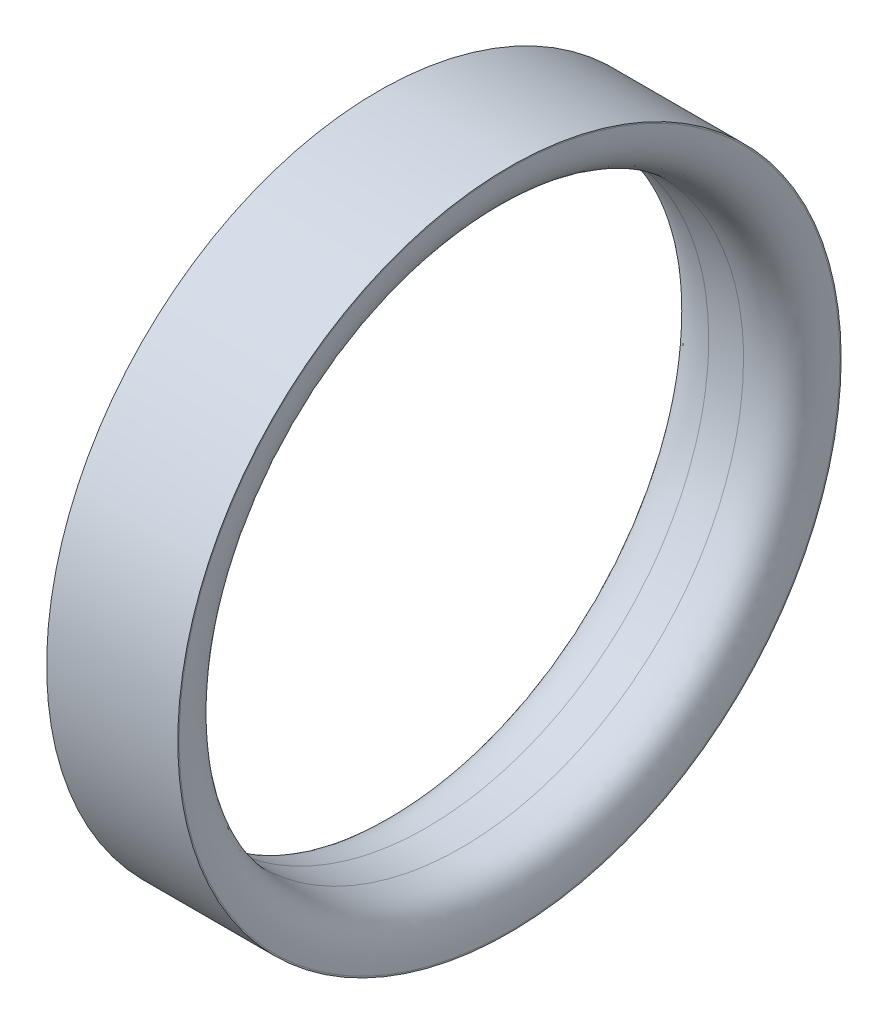
ISO-10303-21;
HEADER;
FILE_DESCRIPTION(('STEP AP214'),'2;1');
FILE_NAME('part.step','',(''),(''),'','','');
FILE_SCHEMA(('AUTOMOTIVE_DESIGN { 1 0 10303 214 1 1 1 1 }'));
ENDSEC;
DATA;
#1=APPLICATION_CONTEXT('core data for automotive mechanical design processes');
#2=APPLICATION_PROTOCOL_DEFINITION('international standard','automotive_design',2000,#1);
#3=PRODUCT_CONTEXT('',#1,'mechanical');
#4=PRODUCT('Part','Part','',(#3));
#5=PRODUCT_RELATED_PRODUCT_CATEGORY('part','',(#4));
#6=PRODUCT_DEFINITION_FORMATION('','',#4);
#7=PRODUCT_DEFINITION_CONTEXT('part definition',#1,'design');
#8=PRODUCT_DEFINITION('design','',#6,#7);
#9=PRODUCT_DEFINITION_SHAPE('','',#8);
#10=(LENGTH_UNIT() NAMED_UNIT(*) SI_UNIT(.MILLI.,.METRE.));
#11=(NAMED_UNIT(*) PLANE_ANGLE_UNIT() SI_UNIT($,.RADIAN.));
#12=(NAMED_UNIT(*) SI_UNIT($,.STERADIAN.) SOLID_ANGLE_UNIT());
#13=UNCERTAINTY_MEASURE_WITH_UNIT(LENGTH_MEASURE(1.E-05),#10,'distance_accuracy_value','');
#14=(GEOMETRIC_REPRESENTATION_CONTEXT(3) GLOBAL_UNCERTAINTY_ASSIGNED_CONTEXT((#13)) GLOBAL_UNIT_ASSIGNED_CONTEXT((#10,
#11,#12)) REPRESENTATION_CONTEXT('',''));
#15=CARTESIAN_POINT('',(0.,0.,0.));
#16=DIRECTION('',(0.,0.,1.));
#17=DIRECTION('',(1.,0.,0.));
#18=AXIS2_PLACEMENT_3D('',#15,#16,#17);
#19=CARTESIAN_POINT('',(0.,0.,0.));
#20=DIRECTION('',(-1.,0.,0.));
#21=DIRECTION('',(0.,0.,1.));
#22=AXIS2_PLACEMENT_3D('',#19,#20,#21);
#23=PLANE('',#22);
#24=CARTESIAN_POINT('',(0.,0.,-34.2915735093941));
#25=CARTESIAN_POINT('',(0.,-4.48815243783443,-34.2915735093941));
#26=CARTESIAN_POINT('',(0.,-13.4644573135032,-32.5060754562533));
#27=CARTESIAN_POINT('',(0.,-24.8790730566352,-24.8790730566351));
#28=CARTESIAN_POINT('',(0.,-32.5060754562532,-13.4644573135034));
#29=CARTESIAN_POINT('',(0.,-35.1843225359646,0.));
#30=CARTESIAN_POINT('',(0.,-32.5060754562532,13.4644573135033));
#31=CARTESIAN_POINT('',(0.,-24.8790730566352,24.8790730566352));
#32=CARTESIAN_POINT('',(0.,-13.4644573135033,32.5060754562532));
#33=CARTESIAN_POINT('',(0.,0.,35.1843225359645));
#34=CARTESIAN_POINT('',(0.,13.4644573135033,32.5060754562532));
#35=CARTESIAN_POINT('',(0.,24.8790730566352,24.8790730566352));
#36=CARTESIAN_POINT('',(0.,32.5060754562533,13.4644573135033));
#37=CARTESIAN_POINT('',(0.,35.1843225359645,0.));
#38=CARTESIAN_POINT('',(0.,32.5060754562532,-13.4644573135033));
#39=CARTESIAN_POINT('',(0.,24.8790730566351,-24.8790730566352));
#40=CARTESIAN_POINT('',(0.,13.4644573135034,-32.5060754562532));
#41=CARTESIAN_POINT('',(0.,4.48815243783444,-34.2915735093941));
#42=CARTESIAN_POINT('',(0.,0.,-34.2915735093941));
#43=B_SPLINE_CURVE_WITH_KNOTS('',3,(#24,#25,#26,#27,#28,#29,#30,#31,#32,#33,#34,#35,#36,#37,#38,
#39,#40,#41,#42),.UNSPECIFIED.,.T.,.F.,(4,1,1,1,1,1,1,1,1,1,1,1,1,1,1,1,4),(-3.14159265358979,
-2.74889357189107,-2.35619449019235,-1.96349540849362,-1.5707963267949,-1.17809724509617,
-0.785398163397448,-0.392699081698724,0.,0.392699081698724,0.785398163397448,1.17809724509617,
1.5707963267949,1.96349540849362,2.35619449019234,2.74889357189107,3.14159265358979),.UNSPECIFIED.);
#44=CARTESIAN_POINT('',(0.,0.,-34.2915735093941));
#45=VERTEX_POINT('',#44);
#46=EDGE_CURVE('E76',#45,#45,#43,.F.);
#47=ORIENTED_EDGE('',*,*,#46,.T.);
#48=EDGE_LOOP('',(#47));
#49=FACE_BOUND('',#48,.T.);
#50=CARTESIAN_POINT('',(0.,0.,0.));
#51=DIRECTION('',(1.,0.,0.));
#52=DIRECTION('',(0.,0.,-1.));
#53=AXIS2_PLACEMENT_3D('',#50,#51,#52);
#54=CIRCLE('',#53,34.4249561596386);
#55=CARTESIAN_POINT('',(0.,0.,-34.4249561596386));
#56=VERTEX_POINT('',#55);
#57=EDGE_CURVE('E82',#56,#56,#54,.T.);
#58=ORIENTED_EDGE('',*,*,#57,.F.);
#59=EDGE_LOOP('',(#58));
#60=FACE_BOUND('',#59,.T.);
#61=ADVANCED_FACE('F50',(#49,#60),#23,.T.);
#62=CARTESIAN_POINT('',(13.6098663886943,0.,0.));
#63=DIRECTION('',(1.,0.,0.));
#64=DIRECTION('',(0.,0.,-1.));
#65=AXIS2_PLACEMENT_3D('',#62,#63,#64);
#66=CYLINDRICAL_SURFACE('',#65,34.4249561596386);
#67=ORIENTED_EDGE('',*,*,#57,.T.);
#68=EDGE_LOOP('',(#67));
#69=FACE_BOUND('',#68,.T.);
#70=CARTESIAN_POINT('',(13.6098663886943,0.,0.));
#71=DIRECTION('',(1.,0.,0.));
#72=DIRECTION('',(0.,0.,-1.));
#73=AXIS2_PLACEMENT_3D('',#70,#71,#72);
#74=CIRCLE('',#73,34.4249561596386);
#75=CARTESIAN_POINT('',(13.6098663886943,0.,-34.4249561596386));
#76=VERTEX_POINT('',#75);
#77=EDGE_CURVE('E88',#76,#76,#74,.T.);
#78=ORIENTED_EDGE('',*,*,#77,.F.);
#79=EDGE_LOOP('',(#78));
#80=FACE_BOUND('',#79,.T.);
#81=ADVANCED_FACE('F115',(#69,#80),#66,.T.);
#82=CARTESIAN_POINT('',(13.6098663886943,34.4249561596386,0.));
#83=DIRECTION('',(1.,0.,0.));
#84=DIRECTION('',(0.,0.,-1.));
#85=AXIS2_PLACEMENT_3D('',#82,#83,#84);
#86=PLANE('',#85);
#87=CARTESIAN_POINT('',(13.6098663886943,0.,-34.2915735093941));
#88=CARTESIAN_POINT('',(13.6098663886943,4.48815243783444,-34.2915735093941));
#89=CARTESIAN_POINT('',(13.6098663886943,13.4644573135033,-32.5060754562533));
#90=CARTESIAN_POINT('',(13.6098663886943,24.8790730566352,-24.8790730566352));
#91=CARTESIAN_POINT('',(13.6098663886943,32.5060754562533,-13.4644573135033));
#92=CARTESIAN_POINT('',(13.6098663886943,35.1843225359646,0.));
#93=CARTESIAN_POINT('',(13.6098663886943,32.5060754562533,13.4644573135033));
#94=CARTESIAN_POINT('',(13.6098663886943,24.8790730566352,24.8790730566352));
#95=CARTESIAN_POINT('',(13.6098663886943,13.4644573135034,32.5060754562532));
#96=CARTESIAN_POINT('',(13.6098663886943,0.,35.1843225359646));
#97=CARTESIAN_POINT('',(13.6098663886943,-13.4644573135032,32.5060754562533));
#98=CARTESIAN_POINT('',(13.6098663886943,-24.8790730566353,24.8790730566351));
#99=CARTESIAN_POINT('',(13.6098663886943,-32.5060754562532,13.4644573135034));
#100=CARTESIAN_POINT('',(13.6098663886943,-35.1843225359646,-1.42954417275217E-13));
#101=CARTESIAN_POINT('',(13.6098663886943,-32.5060754562533,-13.4644573135032));
#102=CARTESIAN_POINT('',(13.6098663886943,-24.8790730566353,-24.8790730566351));
#103=CARTESIAN_POINT('',(13.6098663886943,-13.4644573135033,-32.5060754562533));
#104=CARTESIAN_POINT('',(13.6098663886943,-4.48815243783444,-34.2915735093941));
#105=CARTESIAN_POINT('',(13.6098663886943,0.,-34.2915735093941));
#106=B_SPLINE_CURVE_WITH_KNOTS('',3,(#87,#88,#89,#90,#91,#92,#93,#94,#95,#96,#97,#98,#99,#100,
#101,#102,#103,#104,#105),.UNSPECIFIED.,.T.,.F.,(4,1,1,1,1,1,1,1,1,1,1,1,1,1,1,1,4),(0.,
0.392699081698724,0.785398163397448,1.17809724509617,1.5707963267949,1.96349540849362,
2.35619449019234,2.74889357189107,3.14159265358979,3.53429173528852,3.92699081698724,
4.31968989868597,4.71238898038469,5.10508806208341,5.49778714378214,5.89048622548086,
6.28318530717959),.UNSPECIFIED.);
#107=CARTESIAN_POINT('',(13.6098663886943,0.,-34.2915735093941));
#108=VERTEX_POINT('',#107);
#109=EDGE_CURVE('E11',#108,#108,#106,.F.);
#110=ORIENTED_EDGE('',*,*,#109,.T.);
#111=EDGE_LOOP('',(#110));
#112=FACE_BOUND('',#111,.T.);
#113=ORIENTED_EDGE('',*,*,#77,.T.);
#114=EDGE_LOOP('',(#113));
#115=FACE_BOUND('',#114,.T.);
#116=ADVANCED_FACE('F170',(#112,#115),#86,.T.);
#117=CARTESIAN_POINT('',(0.,0.,0.));
#118=DIRECTION('',(1.,0.,0.));
#119=DIRECTION('',(0.,0.,-1.));
#120=AXIS2_PLACEMENT_3D('',#117,#118,#119);
#121=CYLINDRICAL_SURFACE('',#120,29.2915735093941);
#122=CARTESIAN_POINT('',(5.,0.,-29.2915735093941));
#123=CARTESIAN_POINT('',(5.,3.83374204214278,-29.2915735093941));
#124=CARTESIAN_POINT('',(5.,11.5012261264284,-27.766416098343));
#125=CARTESIAN_POINT('',(5.,21.2514948339824,-21.2514948339824));
#126=CARTESIAN_POINT('',(5.,27.7664160983431,-11.5012261264283));
#127=CARTESIAN_POINT('',(5.,30.0541522149197,0.));
#128=CARTESIAN_POINT('',(5.,27.7664160983431,11.5012261264283));
#129=CARTESIAN_POINT('',(5.,21.2514948339824,21.2514948339824));
#130=CARTESIAN_POINT('',(5.,11.5012261264283,27.766416098343));
#131=CARTESIAN_POINT('',(5.,0.,30.0541522149197));
#132=CARTESIAN_POINT('',(5.,-11.5012261264283,27.766416098343));
#133=CARTESIAN_POINT('',(5.,-21.2514948339824,21.2514948339824));
#134=CARTESIAN_POINT('',(5.,-27.766416098343,11.5012261264283));
#135=CARTESIAN_POINT('',(5.,-30.0541522149197,0.));
#136=CARTESIAN_POINT('',(5.,-27.766416098343,-11.5012261264284));
#137=CARTESIAN_POINT('',(5.,-21.2514948339824,-21.2514948339823));
#138=CARTESIAN_POINT('',(5.,-11.5012261264283,-27.7664160983431));
#139=CARTESIAN_POINT('',(5.,-3.83374204214277,-29.2915735093941));
#140=CARTESIAN_POINT('',(5.,0.,-29.2915735093941));
#141=B_SPLINE_CURVE_WITH_KNOTS('',3,(#122,#123,#124,#125,#126,#127,#128,#129,#130,#131,#132,
#133,#134,#135,#136,#137,#138,#139,#140),.UNSPECIFIED.,.T.,.F.,(4,1,1,1,1,1,1,1,1,1,1,1,1,1,1,1,
4),(-3.14159265358979,-2.74889357189107,-2.35619449019234,-1.96349540849362,-1.5707963267949,
-1.17809724509617,-0.785398163397448,-0.392699081698724,0.,0.392699081698724,0.785398163397448,
1.17809724509617,1.5707963267949,1.96349540849362,2.35619449019235,2.74889357189107,
3.14159265358979),.UNSPECIFIED.);
#142=CARTESIAN_POINT('',(5.,0.,-29.2915735093941));
#143=VERTEX_POINT('',#142);
#144=EDGE_CURVE('E64',#143,#143,#141,.F.);
#145=ORIENTED_EDGE('',*,*,#144,.T.);
#146=EDGE_LOOP('',(#145));
#147=FACE_BOUND('',#146,.T.);
#148=CARTESIAN_POINT('',(8.60986638869432,0.,-29.2915735093941));
#149=CARTESIAN_POINT('',(8.60986638869432,-3.83374204214278,-29.2915735093941));
#150=CARTESIAN_POINT('',(8.60986638869432,-11.5012261264283,-27.7664160983431));
#151=CARTESIAN_POINT('',(8.60986638869433,-21.2514948339825,-21.2514948339823));
#152=CARTESIAN_POINT('',(8.60986638869432,-27.7664160983431,-11.5012261264282));
#153=CARTESIAN_POINT('',(8.60986638869433,-30.0541522149197,-1.21238073369879E-13));
#154=CARTESIAN_POINT('',(8.60986638869432,-27.766416098343,11.5012261264284));
#155=CARTESIAN_POINT('',(8.60986638869432,-21.2514948339824,21.2514948339823));
#156=CARTESIAN_POINT('',(8.60986638869433,-11.5012261264282,27.7664160983431));
#157=CARTESIAN_POINT('',(8.60986638869432,0.,30.0541522149197));
#158=CARTESIAN_POINT('',(8.60986638869433,11.5012261264284,27.766416098343));
#159=CARTESIAN_POINT('',(8.60986638869432,21.2514948339824,21.2514948339824));
#160=CARTESIAN_POINT('',(8.60986638869433,27.7664160983431,11.5012261264283));
#161=CARTESIAN_POINT('',(8.60986638869432,30.0541522149197,0.));
#162=CARTESIAN_POINT('',(8.60986638869432,27.7664160983431,-11.5012261264283));
#163=CARTESIAN_POINT('',(8.60986638869432,21.2514948339824,-21.2514948339824));
#164=CARTESIAN_POINT('',(8.60986638869432,11.5012261264283,-27.7664160983431));
#165=CARTESIAN_POINT('',(8.60986638869432,3.83374204214278,-29.2915735093941));
#166=CARTESIAN_POINT('',(8.60986638869432,0.,-29.2915735093941));
#167=B_SPLINE_CURVE_WITH_KNOTS('',3,(#148,#149,#150,#151,#152,#153,#154,#155,#156,#157,#158,
#159,#160,#161,#162,#163,#164,#165,#166),.UNSPECIFIED.,.T.,.F.,(4,1,1,1,1,1,1,1,1,1,1,1,1,1,1,1,
4),(0.,0.392699081698724,0.785398163397448,1.17809724509617,1.5707963267949,1.96349540849362,
2.35619449019235,2.74889357189107,3.14159265358979,3.53429173528852,3.92699081698724,
4.31968989868597,4.71238898038469,5.10508806208341,5.49778714378214,5.89048622548086,
6.28318530717959),.UNSPECIFIED.);
#168=CARTESIAN_POINT('',(8.60986638869432,0.,-29.2915735093941));
#169=VERTEX_POINT('',#168);
#170=EDGE_CURVE('E70',#169,#169,#167,.F.);
#171=ORIENTED_EDGE('',*,*,#170,.T.);
#172=EDGE_LOOP('',(#171));
#173=FACE_BOUND('',#172,.T.);
#174=ADVANCED_FACE('F125',(#147,#173),#121,.F.);
#175=CARTESIAN_POINT('',(5.,0.,-29.2915735093941));
#176=CARTESIAN_POINT('',(5.,-3.83374204214277,-29.2915735093941));
#177=CARTESIAN_POINT('',(5.,-11.5012261264283,-27.7664160983431));
#178=CARTESIAN_POINT('',(5.,-21.2514948339824,-21.2514948339823));
#179=CARTESIAN_POINT('',(5.,-27.766416098343,-11.5012261264284));
#180=CARTESIAN_POINT('',(5.,-30.0541522149197,0.));
#181=CARTESIAN_POINT('',(5.,-27.766416098343,11.5012261264283));
#182=CARTESIAN_POINT('',(5.,-21.2514948339824,21.2514948339824));
#183=CARTESIAN_POINT('',(5.,-11.5012261264283,27.766416098343));
#184=CARTESIAN_POINT('',(5.,0.,30.0541522149197));
#185=CARTESIAN_POINT('',(5.,11.5012261264283,27.766416098343));
#186=CARTESIAN_POINT('',(5.,21.2514948339824,21.2514948339824));
#187=CARTESIAN_POINT('',(5.,27.7664160983431,11.5012261264283));
#188=CARTESIAN_POINT('',(5.,30.0541522149197,0.));
#189=CARTESIAN_POINT('',(5.,27.7664160983431,-11.5012261264283));
#190=CARTESIAN_POINT('',(5.,21.2514948339824,-21.2514948339824));
#191=CARTESIAN_POINT('',(5.,11.5012261264284,-27.766416098343));
#192=CARTESIAN_POINT('',(5.,3.83374204214278,-29.2915735093941));
#193=CARTESIAN_POINT('',(5.,0.,-29.2915735093941));
#194=CARTESIAN_POINT('',(4.15900974233027,0.,-29.2915735093941));
#195=CARTESIAN_POINT('',(4.15900974233027,-3.83374204214277,-29.2915735093941));
#196=CARTESIAN_POINT('',(4.15900974233027,-11.5012261264283,-27.7664160983431));
#197=CARTESIAN_POINT('',(4.15900974233027,-21.2514948339824,-21.2514948339823));
#198=CARTESIAN_POINT('',(4.15900974233027,-27.766416098343,-11.5012261264284));
#199=CARTESIAN_POINT('',(4.15900974233027,-30.0541522149197,0.));
#200=CARTESIAN_POINT('',(4.15900974233026,-27.766416098343,11.5012261264283));
#201=CARTESIAN_POINT('',(4.15900974233027,-21.2514948339824,21.2514948339824));
#202=CARTESIAN_POINT('',(4.15900974233027,-11.5012261264283,27.766416098343));
#203=CARTESIAN_POINT('',(4.15900974233027,0.,30.0541522149197));
#204=CARTESIAN_POINT('',(4.15900974233027,11.5012261264283,27.766416098343));
#205=CARTESIAN_POINT('',(4.15900974233027,21.2514948339824,21.2514948339824));
#206=CARTESIAN_POINT('',(4.15900974233027,27.7664160983431,11.5012261264283));
#207=CARTESIAN_POINT('',(4.15900974233027,30.0541522149197,0.));
#208=CARTESIAN_POINT('',(4.15900974233027,27.7664160983431,-11.5012261264283));
#209=CARTESIAN_POINT('',(4.15900974233027,21.2514948339824,-21.2514948339824));
#210=CARTESIAN_POINT('',(4.15900974233027,11.5012261264284,-27.766416098343));
#211=CARTESIAN_POINT('',(4.15900974233027,3.83374204214278,-29.2915735093941));
#212=CARTESIAN_POINT('',(4.15900974233027,0.,-29.2915735093941));
#213=CARTESIAN_POINT('',(3.31801948466054,0.,-29.2915735093941));
#214=CARTESIAN_POINT('',(3.31801948466054,-3.83374204214277,-29.2915735093941));
#215=CARTESIAN_POINT('',(3.31801948466054,-11.5012261264283,-27.7664160983431));
#216=CARTESIAN_POINT('',(3.31801948466054,-21.2514948339824,-21.2514948339823));
#217=CARTESIAN_POINT('',(3.31801948466053,-27.766416098343,-11.5012261264284));
#218=CARTESIAN_POINT('',(3.31801948466054,-30.0541522149197,0.));
#219=CARTESIAN_POINT('',(3.31801948466053,-27.766416098343,11.5012261264283));
#220=CARTESIAN_POINT('',(3.31801948466054,-21.2514948339824,21.2514948339824));
#221=CARTESIAN_POINT('',(3.31801948466053,-11.5012261264283,27.766416098343));
#222=CARTESIAN_POINT('',(3.31801948466054,0.,30.0541522149197));
#223=CARTESIAN_POINT('',(3.31801948466053,11.5012261264283,27.766416098343));
#224=CARTESIAN_POINT('',(3.31801948466054,21.2514948339824,21.2514948339824));
#225=CARTESIAN_POINT('',(3.31801948466054,27.7664160983431,11.5012261264283));
#226=CARTESIAN_POINT('',(3.31801948466054,30.0541522149197,0.));
#227=CARTESIAN_POINT('',(3.31801948466053,27.7664160983431,-11.5012261264283));
#228=CARTESIAN_POINT('',(3.31801948466054,21.2514948339824,-21.2514948339824));
#229=CARTESIAN_POINT('',(3.31801948466054,11.5012261264284,-27.766416098343));
#230=CARTESIAN_POINT('',(3.31801948466054,3.83374204214278,-29.2915735093941));
#231=CARTESIAN_POINT('',(3.31801948466054,0.,-29.2915735093941));
#232=CARTESIAN_POINT('',(1.46446609406726,0.,-29.6500331085746));
#233=CARTESIAN_POINT('',(1.46446609406726,-3.8806579797706,-29.6500331085746));
#234=CARTESIAN_POINT('',(1.46446609406726,-11.6419739393117,-28.1062113770807));
#235=CARTESIAN_POINT('',(1.46446609406726,-21.51156288112,-21.5115628811199));
#236=CARTESIAN_POINT('',(1.46446609406726,-28.1062113770807,-11.6419739393119));
#237=CARTESIAN_POINT('',(1.46446609406726,-30.4219439743215,0.));
#238=CARTESIAN_POINT('',(1.46446609406726,-28.1062113770807,11.6419739393118));
#239=CARTESIAN_POINT('',(1.46446609406726,-21.5115628811199,21.51156288112));
#240=CARTESIAN_POINT('',(1.46446609406726,-11.6419739393118,28.1062113770807));
#241=CARTESIAN_POINT('',(1.46446609406726,0.,30.4219439743215));
#242=CARTESIAN_POINT('',(1.46446609406726,11.6419739393118,28.1062113770807));
#243=CARTESIAN_POINT('',(1.46446609406726,21.5115628811199,21.51156288112));
#244=CARTESIAN_POINT('',(1.46446609406726,28.1062113770807,11.6419739393118));
#245=CARTESIAN_POINT('',(1.46446609406726,30.4219439743215,0.));
#246=CARTESIAN_POINT('',(1.46446609406726,28.1062113770807,-11.6419739393118));
#247=CARTESIAN_POINT('',(1.46446609406726,21.5115628811199,-21.51156288112));
#248=CARTESIAN_POINT('',(1.46446609406726,11.6419739393119,-28.1062113770807));
#249=CARTESIAN_POINT('',(1.46446609406726,3.88065797977061,-29.6500331085745));
#250=CARTESIAN_POINT('',(1.46446609406726,0.,-29.6500331085746));
#251=CARTESIAN_POINT('',(0.358459599180417,0.,-30.7560396034614));
#252=CARTESIAN_POINT('',(0.358459599180417,-4.02541440936189,-30.7560396034614));
#253=CARTESIAN_POINT('',(0.35845959918042,-12.0762432280856,-29.1546301837607));
#254=CARTESIAN_POINT('',(0.358459599180414,-22.3139878961128,-22.3139878961127));
#255=CARTESIAN_POINT('',(0.35845959918042,-29.1546301837606,-12.0762432280858));
#256=CARTESIAN_POINT('',(0.358459599180416,-31.5567443133118,0.));
#257=CARTESIAN_POINT('',(0.358459599180419,-29.1546301837607,12.0762432280857));
#258=CARTESIAN_POINT('',(0.358459599180412,-22.3139878961128,22.3139878961128));
#259=CARTESIAN_POINT('',(0.35845959918042,-12.0762432280857,29.1546301837607));
#260=CARTESIAN_POINT('',(0.358459599180415,0.,31.5567443133118));
#261=CARTESIAN_POINT('',(0.358459599180422,12.0762432280857,29.1546301837607));
#262=CARTESIAN_POINT('',(0.358459599180414,22.3139878961128,22.3139878961128));
#263=CARTESIAN_POINT('',(0.358459599180421,29.1546301837607,12.0762432280857));
#264=CARTESIAN_POINT('',(0.358459599180416,31.5567443133118,0.));
#265=CARTESIAN_POINT('',(0.358459599180416,29.1546301837607,-12.0762432280857));
#266=CARTESIAN_POINT('',(0.358459599180415,22.3139878961127,-22.3139878961128));
#267=CARTESIAN_POINT('',(0.35845959918042,12.0762432280858,-29.1546301837607));
#268=CARTESIAN_POINT('',(0.358459599180417,4.0254144093619,-30.7560396034614));
#269=CARTESIAN_POINT('',(0.358459599180417,0.,-30.7560396034614));
#270=CARTESIAN_POINT('',(0.,0.,-32.6095929940547));
#271=CARTESIAN_POINT('',(0.,-4.26801133091664,-32.6095929940547));
#272=CARTESIAN_POINT('',(0.,-12.8040339927498,-30.911672518383));
#273=CARTESIAN_POINT('',(0.,-23.6587698789609,-23.6587698789608));
#274=CARTESIAN_POINT('',(0.,-30.911672518383,-12.80403399275));
#275=CARTESIAN_POINT('',(0.,-33.4585532318905,0.));
#276=CARTESIAN_POINT('',(0.,-30.911672518383,12.8040339927499));
#277=CARTESIAN_POINT('',(0.,-23.6587698789608,23.6587698789609));
#278=CARTESIAN_POINT('',(0.,-12.8040339927499,30.911672518383));
#279=CARTESIAN_POINT('',(0.,0.,33.4585532318905));
#280=CARTESIAN_POINT('',(0.,12.8040339927499,30.911672518383));
#281=CARTESIAN_POINT('',(0.,23.6587698789609,23.6587698789609));
#282=CARTESIAN_POINT('',(0.,30.911672518383,12.8040339927499));
#283=CARTESIAN_POINT('',(0.,33.4585532318905,0.));
#284=CARTESIAN_POINT('',(0.,30.911672518383,-12.8040339927499));
#285=CARTESIAN_POINT('',(0.,23.6587698789608,-23.6587698789609));
#286=CARTESIAN_POINT('',(0.,12.80403399275,-30.911672518383));
#287=CARTESIAN_POINT('',(0.,4.26801133091665,-32.6095929940547));
#288=CARTESIAN_POINT('',(0.,0.,-32.6095929940547));
#289=CARTESIAN_POINT('',(0.,0.,-33.4505832517244));
#290=CARTESIAN_POINT('',(0.,-4.37808188437553,-33.4505832517244));
#291=CARTESIAN_POINT('',(0.,-13.1342456531265,-31.7088739873182));
#292=CARTESIAN_POINT('',(0.,-24.2689214677981,-24.268921467798));
#293=CARTESIAN_POINT('',(0.,-31.7088739873181,-13.1342456531267));
#294=CARTESIAN_POINT('',(0.,-34.3214378839276,0.));
#295=CARTESIAN_POINT('',(0.,-31.7088739873181,13.1342456531266));
#296=CARTESIAN_POINT('',(0.,-24.268921467798,24.2689214677981));
#297=CARTESIAN_POINT('',(0.,-13.1342456531266,31.7088739873181));
#298=CARTESIAN_POINT('',(0.,0.,34.3214378839275));
#299=CARTESIAN_POINT('',(0.,13.1342456531266,31.7088739873181));
#300=CARTESIAN_POINT('',(0.,24.268921467798,24.268921467798));
#301=CARTESIAN_POINT('',(0.,31.7088739873181,13.1342456531266));
#302=CARTESIAN_POINT('',(0.,34.3214378839275,0.));
#303=CARTESIAN_POINT('',(0.,31.7088739873181,-13.1342456531266));
#304=CARTESIAN_POINT('',(0.,24.268921467798,-24.268921467798));
#305=CARTESIAN_POINT('',(0.,13.1342456531267,-31.7088739873181));
#306=CARTESIAN_POINT('',(0.,4.37808188437554,-33.4505832517244));
#307=CARTESIAN_POINT('',(0.,0.,-33.4505832517244));
#308=CARTESIAN_POINT('',(0.,0.,-34.2915735093941));
#309=CARTESIAN_POINT('',(0.,-4.48815243783443,-34.2915735093941));
#310=CARTESIAN_POINT('',(0.,-13.4644573135032,-32.5060754562533));
#311=CARTESIAN_POINT('',(0.,-24.8790730566353,-24.8790730566351));
#312=CARTESIAN_POINT('',(0.,-32.5060754562532,-13.4644573135034));
#313=CARTESIAN_POINT('',(0.,-35.1843225359646,0.));
#314=CARTESIAN_POINT('',(0.,-32.5060754562533,13.4644573135033));
#315=CARTESIAN_POINT('',(0.,-24.8790730566352,24.8790730566352));
#316=CARTESIAN_POINT('',(0.,-13.4644573135033,32.5060754562533));
#317=CARTESIAN_POINT('',(0.,0.,35.1843225359646));
#318=CARTESIAN_POINT('',(0.,13.4644573135033,32.5060754562533));
#319=CARTESIAN_POINT('',(0.,24.8790730566352,24.8790730566352));
#320=CARTESIAN_POINT('',(0.,32.5060754562533,13.4644573135033));
#321=CARTESIAN_POINT('',(0.,35.1843225359646,0.));
#322=CARTESIAN_POINT('',(0.,32.5060754562533,-13.4644573135033));
#323=CARTESIAN_POINT('',(0.,24.8790730566352,-24.8790730566352));
#324=CARTESIAN_POINT('',(0.,13.4644573135034,-32.5060754562532));
#325=CARTESIAN_POINT('',(0.,4.48815243783444,-34.2915735093941));
#326=CARTESIAN_POINT('',(0.,0.,-34.2915735093941));
#327=B_SPLINE_SURFACE_WITH_KNOTS('',5,3,((#175,#176,#177,#178,#179,#180,#181,#182,#183,#184,
#185,#186,#187,#188,#189,#190,#191,#192,#193),(#194,#195,#196,#197,#198,#199,#200,#201,#202,
#203,#204,#205,#206,#207,#208,#209,#210,#211,#212),(#213,#214,#215,#216,#217,#218,#219,#220,
#221,#222,#223,#224,#225,#226,#227,#228,#229,#230,#231),(#232,#233,#234,#235,#236,#237,#238,
#239,#240,#241,#242,#243,#244,#245,#246,#247,#248,#249,#250),(#251,#252,#253,#254,#255,#256,
#257,#258,#259,#260,#261,#262,#263,#264,#265,#266,#267,#268,#269),(#270,#271,#272,#273,#274,
#275,#276,#277,#278,#279,#280,#281,#282,#283,#284,#285,#286,#287,#288),(#289,#290,#291,#292,
#293,#294,#295,#296,#297,#298,#299,#300,#301,#302,#303,#304,#305,#306,#307),(#308,#309,#310,
#311,#312,#313,#314,#315,#316,#317,#318,#319,#320,#321,#322,#323,#324,#325,#326)),.UNSPECIFIED.,
.F.,.T.,.F.,(6,2,6),(4,1,1,1,1,1,1,1,1,1,1,1,1,1,1,1,4),(0.,0.5,1.),(-3.14159265358979,
-2.74889357189107,-2.35619449019235,-1.96349540849362,-1.5707963267949,-1.17809724509617,
-0.785398163397448,-0.392699081698724,0.,0.392699081698724,0.785398163397448,1.17809724509617,
1.5707963267949,1.96349540849362,2.35619449019234,2.74889357189107,3.14159265358979),.UNSPECIFIED.);
#328=ORIENTED_EDGE('',*,*,#144,.F.);
#329=EDGE_LOOP('',(#328));
#330=FACE_BOUND('',#329,.T.);
#331=ORIENTED_EDGE('',*,*,#46,.F.);
#332=EDGE_LOOP('',(#331));
#333=FACE_BOUND('',#332,.T.);
#334=ADVANCED_FACE('F118',(#330,#333),#327,.T.);
#335=CARTESIAN_POINT('',(8.60986638869432,0.,-29.2915735093941));
#336=CARTESIAN_POINT('',(8.60986638869432,3.83374204214278,-29.2915735093941));
#337=CARTESIAN_POINT('',(8.60986638869432,11.5012261264283,-27.7664160983431));
#338=CARTESIAN_POINT('',(8.60986638869432,21.2514948339824,-21.2514948339824));
#339=CARTESIAN_POINT('',(8.60986638869432,27.7664160983431,-11.5012261264283));
#340=CARTESIAN_POINT('',(8.60986638869432,30.0541522149197,0.));
#341=CARTESIAN_POINT('',(8.60986638869433,27.7664160983431,11.5012261264283));
#342=CARTESIAN_POINT('',(8.60986638869432,21.2514948339824,21.2514948339824));
#343=CARTESIAN_POINT('',(8.60986638869433,11.5012261264284,27.766416098343));
#344=CARTESIAN_POINT('',(8.60986638869432,0.,30.0541522149197));
#345=CARTESIAN_POINT('',(8.60986638869433,-11.5012261264282,27.7664160983431));
#346=CARTESIAN_POINT('',(8.60986638869432,-21.2514948339824,21.2514948339823));
#347=CARTESIAN_POINT('',(8.60986638869432,-27.766416098343,11.5012261264284));
#348=CARTESIAN_POINT('',(8.60986638869433,-30.0541522149197,-1.21238073369879E-13));
#349=CARTESIAN_POINT('',(8.60986638869432,-27.7664160983431,-11.5012261264282));
#350=CARTESIAN_POINT('',(8.60986638869433,-21.2514948339825,-21.2514948339823));
#351=CARTESIAN_POINT('',(8.60986638869432,-11.5012261264283,-27.7664160983431));
#352=CARTESIAN_POINT('',(8.60986638869432,-3.83374204214278,-29.2915735093941));
#353=CARTESIAN_POINT('',(8.60986638869432,0.,-29.2915735093941));
#354=CARTESIAN_POINT('',(9.45085664636406,0.,-29.2915735093941));
#355=CARTESIAN_POINT('',(9.45085664636406,3.83374204214278,-29.2915735093941));
#356=CARTESIAN_POINT('',(9.45085664636406,11.5012261264283,-27.7664160983431));
#357=CARTESIAN_POINT('',(9.45085664636406,21.2514948339824,-21.2514948339824));
#358=CARTESIAN_POINT('',(9.45085664636406,27.7664160983431,-11.5012261264283));
#359=CARTESIAN_POINT('',(9.45085664636406,30.0541522149197,0.));
#360=CARTESIAN_POINT('',(9.45085664636406,27.7664160983431,11.5012261264283));
#361=CARTESIAN_POINT('',(9.45085664636405,21.2514948339824,21.2514948339824));
#362=CARTESIAN_POINT('',(9.45085664636406,11.5012261264284,27.766416098343));
#363=CARTESIAN_POINT('',(9.45085664636405,0.,30.0541522149197));
#364=CARTESIAN_POINT('',(9.45085664636406,-11.5012261264282,27.7664160983431));
#365=CARTESIAN_POINT('',(9.45085664636406,-21.2514948339824,21.2514948339823));
#366=CARTESIAN_POINT('',(9.45085664636406,-27.766416098343,11.5012261264284));
#367=CARTESIAN_POINT('',(9.45085664636406,-30.0541522149197,-1.21238073369879E-13));
#368=CARTESIAN_POINT('',(9.45085664636406,-27.7664160983431,-11.5012261264282));
#369=CARTESIAN_POINT('',(9.45085664636406,-21.2514948339825,-21.2514948339823));
#370=CARTESIAN_POINT('',(9.45085664636406,-11.5012261264283,-27.7664160983431));
#371=CARTESIAN_POINT('',(9.45085664636406,-3.83374204214278,-29.2915735093941));
#372=CARTESIAN_POINT('',(9.45085664636406,0.,-29.2915735093941));
#373=CARTESIAN_POINT('',(10.2918469040338,0.,-29.2915735093941));
#374=CARTESIAN_POINT('',(10.2918469040338,3.83374204214278,-29.2915735093941));
#375=CARTESIAN_POINT('',(10.2918469040338,11.5012261264283,-27.7664160983431));
#376=CARTESIAN_POINT('',(10.2918469040338,21.2514948339824,-21.2514948339824));
#377=CARTESIAN_POINT('',(10.2918469040338,27.7664160983431,-11.5012261264283));
#378=CARTESIAN_POINT('',(10.2918469040338,30.0541522149197,0.));
#379=CARTESIAN_POINT('',(10.2918469040338,27.7664160983431,11.5012261264283));
#380=CARTESIAN_POINT('',(10.2918469040338,21.2514948339824,21.2514948339824));
#381=CARTESIAN_POINT('',(10.2918469040338,11.5012261264284,27.766416098343));
#382=CARTESIAN_POINT('',(10.2918469040338,0.,30.0541522149197));
#383=CARTESIAN_POINT('',(10.2918469040338,-11.5012261264282,27.7664160983431));
#384=CARTESIAN_POINT('',(10.2918469040338,-21.2514948339824,21.2514948339823));
#385=CARTESIAN_POINT('',(10.2918469040338,-27.766416098343,11.5012261264284));
#386=CARTESIAN_POINT('',(10.2918469040338,-30.0541522149197,-1.21238073369879E-13));
#387=CARTESIAN_POINT('',(10.2918469040338,-27.7664160983431,-11.5012261264282));
#388=CARTESIAN_POINT('',(10.2918469040338,-21.2514948339825,-21.2514948339823));
#389=CARTESIAN_POINT('',(10.2918469040338,-11.5012261264283,-27.7664160983431));
#390=CARTESIAN_POINT('',(10.2918469040338,-3.83374204214278,-29.2915735093941));
#391=CARTESIAN_POINT('',(10.2918469040338,0.,-29.2915735093941));
#392=CARTESIAN_POINT('',(12.1454002946271,0.,-29.6500331085746));
#393=CARTESIAN_POINT('',(12.1454002946271,3.88065797977061,-29.6500331085746));
#394=CARTESIAN_POINT('',(12.1454002946271,11.6419739393118,-28.1062113770807));
#395=CARTESIAN_POINT('',(12.1454002946271,21.5115628811199,-21.51156288112));
#396=CARTESIAN_POINT('',(12.1454002946271,28.1062113770807,-11.6419739393118));
#397=CARTESIAN_POINT('',(12.1454002946271,30.4219439743215,0.));
#398=CARTESIAN_POINT('',(12.1454002946271,28.1062113770807,11.6419739393118));
#399=CARTESIAN_POINT('',(12.1454002946271,21.5115628811199,21.51156288112));
#400=CARTESIAN_POINT('',(12.1454002946271,11.6419739393119,28.1062113770807));
#401=CARTESIAN_POINT('',(12.1454002946271,0.,30.4219439743215));
#402=CARTESIAN_POINT('',(12.1454002946271,-11.6419739393117,28.1062113770807));
#403=CARTESIAN_POINT('',(12.1454002946271,-21.51156288112,21.5115628811199));
#404=CARTESIAN_POINT('',(12.1454002946271,-28.1062113770807,11.6419739393119));
#405=CARTESIAN_POINT('',(12.1454002946271,-30.4219439743215,-1.23118952912659E-13));
#406=CARTESIAN_POINT('',(12.1454002946271,-28.1062113770807,-11.6419739393117));
#407=CARTESIAN_POINT('',(12.1454002946271,-21.51156288112,-21.5115628811199));
#408=CARTESIAN_POINT('',(12.1454002946271,-11.6419739393118,-28.1062113770807));
#409=CARTESIAN_POINT('',(12.1454002946271,-3.88065797977061,-29.6500331085746));
#410=CARTESIAN_POINT('',(12.1454002946271,0.,-29.6500331085746));
#411=CARTESIAN_POINT('',(13.2514067895139,0.,-30.7560396034614));
#412=CARTESIAN_POINT('',(13.2514067895139,4.0254144093619,-30.7560396034614));
#413=CARTESIAN_POINT('',(13.2514067895139,12.0762432280857,-29.1546301837607));
#414=CARTESIAN_POINT('',(13.2514067895139,22.3139878961128,-22.3139878961128));
#415=CARTESIAN_POINT('',(13.2514067895139,29.1546301837607,-12.0762432280856));
#416=CARTESIAN_POINT('',(13.2514067895139,31.5567443133118,0.));
#417=CARTESIAN_POINT('',(13.2514067895139,29.1546301837607,12.0762432280857));
#418=CARTESIAN_POINT('',(13.2514067895139,22.3139878961127,22.3139878961128));
#419=CARTESIAN_POINT('',(13.2514067895139,12.0762432280858,29.1546301837606));
#420=CARTESIAN_POINT('',(13.2514067895139,0.,31.5567443133118));
#421=CARTESIAN_POINT('',(13.2514067895139,-12.0762432280856,29.1546301837607));
#422=CARTESIAN_POINT('',(13.2514067895139,-22.3139878961128,22.3139878961127));
#423=CARTESIAN_POINT('',(13.2514067895139,-29.1546301837606,12.0762432280858));
#424=CARTESIAN_POINT('',(13.2514067895139,-31.5567443133118,-1.28858321316742E-13));
#425=CARTESIAN_POINT('',(13.2514067895139,-29.1546301837607,-12.0762432280856));
#426=CARTESIAN_POINT('',(13.2514067895139,-22.3139878961129,-22.3139878961127));
#427=CARTESIAN_POINT('',(13.2514067895139,-12.0762432280857,-29.1546301837607));
#428=CARTESIAN_POINT('',(13.2514067895139,-4.02541440936189,-30.7560396034614));
#429=CARTESIAN_POINT('',(13.2514067895139,0.,-30.7560396034614));
#430=CARTESIAN_POINT('',(13.6098663886943,0.,-32.6095929940547));
#431=CARTESIAN_POINT('',(13.6098663886943,4.26801133091665,-32.6095929940547));
#432=CARTESIAN_POINT('',(13.6098663886943,12.8040339927499,-30.911672518383));
#433=CARTESIAN_POINT('',(13.6098663886943,23.6587698789609,-23.6587698789609));
#434=CARTESIAN_POINT('',(13.6098663886943,30.911672518383,-12.8040339927499));
#435=CARTESIAN_POINT('',(13.6098663886943,33.4585532318905,0.));
#436=CARTESIAN_POINT('',(13.6098663886943,30.911672518383,12.8040339927499));
#437=CARTESIAN_POINT('',(13.6098663886943,23.6587698789608,23.6587698789609));
#438=CARTESIAN_POINT('',(13.6098663886943,12.80403399275,30.911672518383));
#439=CARTESIAN_POINT('',(13.6098663886943,0.,33.4585532318905));
#440=CARTESIAN_POINT('',(13.6098663886943,-12.8040339927498,30.911672518383));
#441=CARTESIAN_POINT('',(13.6098663886943,-23.6587698789609,23.6587698789608));
#442=CARTESIAN_POINT('',(13.6098663886943,-30.911672518383,12.80403399275));
#443=CARTESIAN_POINT('',(13.6098663886943,-33.4585532318905,-1.35318658739392E-13));
#444=CARTESIAN_POINT('',(13.6098663886943,-30.911672518383,-12.8040339927498));
#445=CARTESIAN_POINT('',(13.6098663886943,-23.658769878961,-23.6587698789608));
#446=CARTESIAN_POINT('',(13.6098663886943,-12.8040339927499,-30.911672518383));
#447=CARTESIAN_POINT('',(13.6098663886943,-4.26801133091664,-32.6095929940547));
#448=CARTESIAN_POINT('',(13.6098663886943,0.,-32.6095929940547));
#449=CARTESIAN_POINT('',(13.6098663886943,0.,-33.4505832517244));
#450=CARTESIAN_POINT('',(13.6098663886943,4.37808188437554,-33.4505832517244));
#451=CARTESIAN_POINT('',(13.6098663886943,13.1342456531266,-31.7088739873181));
#452=CARTESIAN_POINT('',(13.6098663886943,24.268921467798,-24.268921467798));
#453=CARTESIAN_POINT('',(13.6098663886943,31.7088739873181,-13.1342456531266));
#454=CARTESIAN_POINT('',(13.6098663886943,34.3214378839275,0.));
#455=CARTESIAN_POINT('',(13.6098663886943,31.7088739873182,13.1342456531266));
#456=CARTESIAN_POINT('',(13.6098663886943,24.268921467798,24.268921467798));
#457=CARTESIAN_POINT('',(13.6098663886943,13.1342456531267,31.7088739873181));
#458=CARTESIAN_POINT('',(13.6098663886943,0.,34.3214378839275));
#459=CARTESIAN_POINT('',(13.6098663886943,-13.1342456531265,31.7088739873182));
#460=CARTESIAN_POINT('',(13.6098663886943,-24.2689214677981,24.268921467798));
#461=CARTESIAN_POINT('',(13.6098663886943,-31.7088739873181,13.1342456531267));
#462=CARTESIAN_POINT('',(13.6098663886943,-34.3214378839276,-1.38787924525213E-13));
#463=CARTESIAN_POINT('',(13.6098663886943,-31.7088739873181,-13.1342456531265));
#464=CARTESIAN_POINT('',(13.6098663886943,-24.2689214677981,-24.268921467798));
#465=CARTESIAN_POINT('',(13.6098663886943,-13.1342456531266,-31.7088739873181));
#466=CARTESIAN_POINT('',(13.6098663886943,-4.37808188437554,-33.4505832517244));
#467=CARTESIAN_POINT('',(13.6098663886943,0.,-33.4505832517244));
#468=CARTESIAN_POINT('',(13.6098663886943,0.,-34.2915735093941));
#469=CARTESIAN_POINT('',(13.6098663886943,4.48815243783444,-34.2915735093941));
#470=CARTESIAN_POINT('',(13.6098663886943,13.4644573135033,-32.5060754562533));
#471=CARTESIAN_POINT('',(13.6098663886943,24.8790730566352,-24.8790730566352));
#472=CARTESIAN_POINT('',(13.6098663886943,32.5060754562533,-13.4644573135033));
#473=CARTESIAN_POINT('',(13.6098663886943,35.1843225359646,0.));
#474=CARTESIAN_POINT('',(13.6098663886943,32.5060754562533,13.4644573135033));
#475=CARTESIAN_POINT('',(13.6098663886943,24.8790730566352,24.8790730566352));
#476=CARTESIAN_POINT('',(13.6098663886943,13.4644573135034,32.5060754562532));
#477=CARTESIAN_POINT('',(13.6098663886943,0.,35.1843225359646));
#478=CARTESIAN_POINT('',(13.6098663886943,-13.4644573135032,32.5060754562533));
#479=CARTESIAN_POINT('',(13.6098663886943,-24.8790730566353,24.8790730566351));
#480=CARTESIAN_POINT('',(13.6098663886943,-32.5060754562532,13.4644573135034));
#481=CARTESIAN_POINT('',(13.6098663886943,-35.1843225359646,-1.42954417275217E-13));
#482=CARTESIAN_POINT('',(13.6098663886943,-32.5060754562533,-13.4644573135032));
#483=CARTESIAN_POINT('',(13.6098663886943,-24.8790730566353,-24.8790730566351));
#484=CARTESIAN_POINT('',(13.6098663886943,-13.4644573135033,-32.5060754562533));
#485=CARTESIAN_POINT('',(13.6098663886943,-4.48815243783444,-34.2915735093941));
#486=CARTESIAN_POINT('',(13.6098663886943,0.,-34.2915735093941));
#487=B_SPLINE_SURFACE_WITH_KNOTS('',5,3,((#335,#336,#337,#338,#339,#340,#341,#342,#343,#344,
#345,#346,#347,#348,#349,#350,#351,#352,#353),(#354,#355,#356,#357,#358,#359,#360,#361,#362,
#363,#364,#365,#366,#367,#368,#369,#370,#371,#372),(#373,#374,#375,#376,#377,#378,#379,#380,
#381,#382,#383,#384,#385,#386,#387,#388,#389,#390,#391),(#392,#393,#394,#395,#396,#397,#398,
#399,#400,#401,#402,#403,#404,#405,#406,#407,#408,#409,#410),(#411,#412,#413,#414,#415,#416,
#417,#418,#419,#420,#421,#422,#423,#424,#425,#426,#427,#428,#429),(#430,#431,#432,#433,#434,
#435,#436,#437,#438,#439,#440,#441,#442,#443,#444,#445,#446,#447,#448),(#449,#450,#451,#452,
#453,#454,#455,#456,#457,#458,#459,#460,#461,#462,#463,#464,#465,#466,#467),(#468,#469,#470,
#471,#472,#473,#474,#475,#476,#477,#478,#479,#480,#481,#482,#483,#484,#485,#486)),.UNSPECIFIED.,
.F.,.T.,.F.,(6,2,6),(4,1,1,1,1,1,1,1,1,1,1,1,1,1,1,1,4),(0.,0.5,1.),(0.,0.392699081698724,
0.785398163397448,1.17809724509617,1.5707963267949,1.96349540849362,2.35619449019234,
2.74889357189107,3.14159265358979,3.53429173528852,3.92699081698724,4.31968989868597,
4.71238898038469,5.10508806208341,5.49778714378214,5.89048622548086,6.28318530717959),.UNSPECIFIED.);
#488=ORIENTED_EDGE('',*,*,#109,.F.);
#489=EDGE_LOOP('',(#488));
#490=FACE_BOUND('',#489,.T.);
#491=ORIENTED_EDGE('',*,*,#170,.F.);
#492=EDGE_LOOP('',(#491));
#493=FACE_BOUND('',#492,.T.);
#494=ADVANCED_FACE('F53',(#490,#493),#487,.T.);
#495=CLOSED_SHELL('',(#61,#81,#116,#174,#334,#494));
#496=MANIFOLD_SOLID_BREP('B2',#495);
#497=ADVANCED_BREP_SHAPE_REPRESENTATION('',(#18,#496),#14);
#498=SHAPE_DEFINITION_REPRESENTATION(#9,#497);
ENDSEC;
END-ISO-10303-21;
